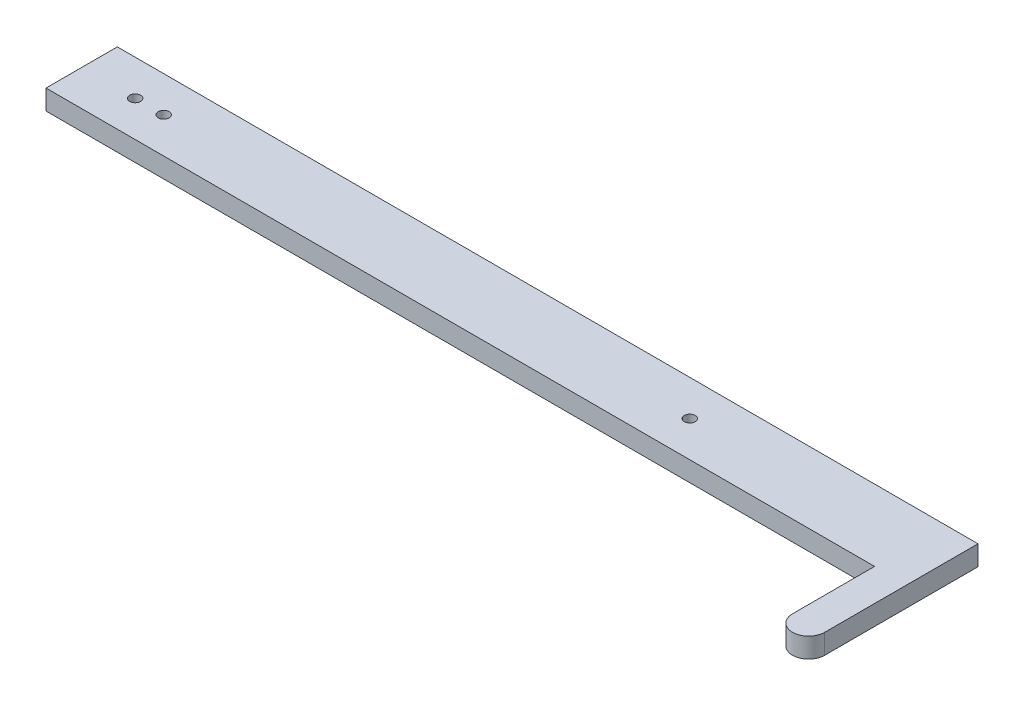
ISO-10303-21;
HEADER;
FILE_DESCRIPTION(('STEP AP214'),'2;1');
FILE_NAME('part.step','',(''),(''),'','','');
FILE_SCHEMA(('AUTOMOTIVE_DESIGN { 1 0 10303 214 1 1 1 1 }'));
ENDSEC;
DATA;
#1=APPLICATION_CONTEXT('core data for automotive mechanical design processes');
#2=APPLICATION_PROTOCOL_DEFINITION('international standard','automotive_design',2000,#1);
#3=PRODUCT_CONTEXT('',#1,'mechanical');
#4=PRODUCT('Part','Part','',(#3));
#5=PRODUCT_RELATED_PRODUCT_CATEGORY('part','',(#4));
#6=PRODUCT_DEFINITION_FORMATION('','',#4);
#7=PRODUCT_DEFINITION_CONTEXT('part definition',#1,'design');
#8=PRODUCT_DEFINITION('design','',#6,#7);
#9=PRODUCT_DEFINITION_SHAPE('','',#8);
#10=(LENGTH_UNIT() NAMED_UNIT(*) SI_UNIT(.MILLI.,.METRE.));
#11=(NAMED_UNIT(*) PLANE_ANGLE_UNIT() SI_UNIT($,.RADIAN.));
#12=(NAMED_UNIT(*) SI_UNIT($,.STERADIAN.) SOLID_ANGLE_UNIT());
#13=UNCERTAINTY_MEASURE_WITH_UNIT(LENGTH_MEASURE(1.E-05),#10,'distance_accuracy_value','');
#14=(GEOMETRIC_REPRESENTATION_CONTEXT(3) GLOBAL_UNCERTAINTY_ASSIGNED_CONTEXT((#13)) GLOBAL_UNIT_ASSIGNED_CONTEXT((#10,
#11,#12)) REPRESENTATION_CONTEXT('',''));
#15=CARTESIAN_POINT('',(0.,0.,0.));
#16=DIRECTION('',(0.,0.,1.));
#17=DIRECTION('',(1.,0.,0.));
#18=AXIS2_PLACEMENT_3D('',#15,#16,#17);
#19=CARTESIAN_POINT('',(-167.258825084748,5.588,-11.5655431332389));
#20=DIRECTION('',(1.,0.,0.));
#21=DIRECTION('',(0.,0.,-1.));
#22=AXIS2_PLACEMENT_3D('',#19,#20,#21);
#23=PLANE('',#22);
#24=DIRECTION('',(0.,0.,1.));
#25=VECTOR('',#24,1.);
#26=CARTESIAN_POINT('',(-167.258825084748,0.,-11.5655431332389));
#27=LINE('',#26,#25);
#28=CARTESIAN_POINT('',(-167.258825084748,0.,-11.5655431332389));
#29=VERTEX_POINT('',#28);
#30=CARTESIAN_POINT('',(-167.258825084748,0.,8.43445686676112));
#31=VERTEX_POINT('',#30);
#32=EDGE_CURVE('E122',#29,#31,#27,.T.);
#33=ORIENTED_EDGE('',*,*,#32,.T.);
#34=DIRECTION('',(0.,-1.,0.));
#35=VECTOR('',#34,1.);
#36=CARTESIAN_POINT('',(-167.258825084748,5.588,8.43445686676112));
#37=LINE('',#36,#35);
#38=CARTESIAN_POINT('',(-167.258825084748,5.588,8.43445686676112));
#39=VERTEX_POINT('',#38);
#40=EDGE_CURVE('E11',#39,#31,#37,.T.);
#41=ORIENTED_EDGE('',*,*,#40,.F.);
#42=DIRECTION('',(0.,0.,1.));
#43=VECTOR('',#42,1.);
#44=CARTESIAN_POINT('',(-167.258825084748,5.588,-11.5655431332389));
#45=LINE('',#44,#43);
#46=CARTESIAN_POINT('',(-167.258825084748,5.588,-11.5655431332389));
#47=VERTEX_POINT('',#46);
#48=EDGE_CURVE('E116',#47,#39,#45,.T.);
#49=ORIENTED_EDGE('',*,*,#48,.F.);
#50=DIRECTION('',(0.,-1.,0.));
#51=VECTOR('',#50,1.);
#52=CARTESIAN_POINT('',(-167.258825084748,5.588,-11.5655431332389));
#53=LINE('',#52,#51);
#54=EDGE_CURVE('E114',#47,#29,#53,.T.);
#55=ORIENTED_EDGE('',*,*,#54,.T.);
#56=EDGE_LOOP('',(#33,#41,#49,#55));
#57=FACE_BOUND('',#56,.T.);
#58=ADVANCED_FACE('F32',(#57),#23,.F.);
#59=CARTESIAN_POINT('',(-167.258825084748,5.588,8.43445686676112));
#60=DIRECTION('',(0.,0.,-1.));
#61=DIRECTION('',(-1.,0.,0.));
#62=AXIS2_PLACEMENT_3D('',#59,#60,#61);
#63=PLANE('',#62);
#64=DIRECTION('',(1.,0.,0.));
#65=VECTOR('',#64,1.);
#66=CARTESIAN_POINT('',(-167.258825084748,0.,8.43445686676112));
#67=LINE('',#66,#65);
#68=CARTESIAN_POINT('',(65.0411749152516,0.,8.43445686676112));
#69=VERTEX_POINT('',#68);
#70=EDGE_CURVE('E125',#31,#69,#67,.T.);
#71=ORIENTED_EDGE('',*,*,#70,.T.);
#72=DIRECTION('',(0.,1.,0.));
#73=VECTOR('',#72,1.);
#74=CARTESIAN_POINT('',(65.0411749152516,-24.6981780704569,8.43445686676112));
#75=LINE('',#74,#73);
#76=CARTESIAN_POINT('',(65.0411749152515,5.588,8.43445686676112));
#77=VERTEX_POINT('',#76);
#78=EDGE_CURVE('E105',#69,#77,#75,.T.);
#79=ORIENTED_EDGE('',*,*,#78,.T.);
#80=DIRECTION('',(1.,0.,0.));
#81=VECTOR('',#80,1.);
#82=CARTESIAN_POINT('',(-167.258825084748,5.588,8.43445686676112));
#83=LINE('',#82,#81);
#84=EDGE_CURVE('E79',#39,#77,#83,.T.);
#85=ORIENTED_EDGE('',*,*,#84,.F.);
#86=ORIENTED_EDGE('',*,*,#40,.T.);
#87=EDGE_LOOP('',(#71,#79,#85,#86));
#88=FACE_BOUND('',#87,.T.);
#89=ADVANCED_FACE('F168',(#88),#63,.F.);
#90=CARTESIAN_POINT('',(74.0411749152516,5.588,-11.5655431332389));
#91=DIRECTION('',(-1.,0.,0.));
#92=DIRECTION('',(0.,0.,1.));
#93=AXIS2_PLACEMENT_3D('',#90,#91,#92);
#94=PLANE('',#93);
#95=DIRECTION('',(0.,0.,-1.));
#96=VECTOR('',#95,1.);
#97=CARTESIAN_POINT('',(74.0411749152516,0.,-11.5655431332389));
#98=LINE('',#97,#96);
#99=CARTESIAN_POINT('',(74.0411749152516,0.,31.4344568667611));
#100=VERTEX_POINT('',#99);
#101=CARTESIAN_POINT('',(74.0411749152516,0.,-11.5655431332389));
#102=VERTEX_POINT('',#101);
#103=EDGE_CURVE('E129',#100,#102,#98,.T.);
#104=ORIENTED_EDGE('',*,*,#103,.T.);
#105=DIRECTION('',(0.,-1.,0.));
#106=VECTOR('',#105,1.);
#107=CARTESIAN_POINT('',(74.0411749152516,5.588,-11.5655431332389));
#108=LINE('',#107,#106);
#109=CARTESIAN_POINT('',(74.0411749152516,5.588,-11.5655431332389));
#110=VERTEX_POINT('',#109);
#111=EDGE_CURVE('E40',#110,#102,#108,.T.);
#112=ORIENTED_EDGE('',*,*,#111,.F.);
#113=DIRECTION('',(0.,0.,-1.));
#114=VECTOR('',#113,1.);
#115=CARTESIAN_POINT('',(74.0411749152516,5.588,-11.5655431332389));
#116=LINE('',#115,#114);
#117=CARTESIAN_POINT('',(74.0411749152516,5.588,31.4344568667611));
#118=VERTEX_POINT('',#117);
#119=EDGE_CURVE('E109',#118,#110,#116,.T.);
#120=ORIENTED_EDGE('',*,*,#119,.F.);
#121=DIRECTION('',(0.,1.,0.));
#122=VECTOR('',#121,1.);
#123=CARTESIAN_POINT('',(74.0411749152516,-24.6981780704569,31.4344568667611));
#124=LINE('',#123,#122);
#125=EDGE_CURVE('E96',#100,#118,#124,.T.);
#126=ORIENTED_EDGE('',*,*,#125,.F.);
#127=EDGE_LOOP('',(#104,#112,#120,#126));
#128=FACE_BOUND('',#127,.T.);
#129=ADVANCED_FACE('F112',(#128),#94,.F.);
#130=CARTESIAN_POINT('',(-167.258825084748,5.588,-11.5655431332389));
#131=DIRECTION('',(0.,0.,1.));
#132=DIRECTION('',(1.,0.,0.));
#133=AXIS2_PLACEMENT_3D('',#130,#131,#132);
#134=PLANE('',#133);
#135=DIRECTION('',(-1.,0.,0.));
#136=VECTOR('',#135,1.);
#137=CARTESIAN_POINT('',(-167.258825084748,0.,-11.5655431332389));
#138=LINE('',#137,#136);
#139=EDGE_CURVE('E74',#102,#29,#138,.T.);
#140=ORIENTED_EDGE('',*,*,#139,.T.);
#141=ORIENTED_EDGE('',*,*,#54,.F.);
#142=DIRECTION('',(-1.,0.,0.));
#143=VECTOR('',#142,1.);
#144=CARTESIAN_POINT('',(-167.258825084748,5.588,-11.5655431332389));
#145=LINE('',#144,#143);
#146=EDGE_CURVE('E57',#110,#47,#145,.T.);
#147=ORIENTED_EDGE('',*,*,#146,.F.);
#148=ORIENTED_EDGE('',*,*,#111,.T.);
#149=EDGE_LOOP('',(#140,#141,#147,#148));
#150=FACE_BOUND('',#149,.T.);
#151=ADVANCED_FACE('F163',(#150),#134,.F.);
#152=CARTESIAN_POINT('',(0.,5.588,0.));
#153=DIRECTION('',(0.,1.,0.));
#154=DIRECTION('',(0.,0.,1.));
#155=AXIS2_PLACEMENT_3D('',#152,#153,#154);
#156=PLANE('',#155);
#157=CARTESIAN_POINT('',(-144.258825084748,5.588,-1.56554313323885));
#158=DIRECTION('',(0.,1.,0.));
#159=DIRECTION('',(0.,0.,1.));
#160=AXIS2_PLACEMENT_3D('',#157,#158,#159);
#161=CIRCLE('',#160,1.52500000000001);
#162=CARTESIAN_POINT('',(-144.258825084748,5.588,-0.0405431332388456));
#163=VERTEX_POINT('',#162);
#164=EDGE_CURVE('E144',#163,#163,#161,.T.);
#165=ORIENTED_EDGE('',*,*,#164,.F.);
#166=EDGE_LOOP('',(#165));
#167=FACE_BOUND('',#166,.T.);
#168=CARTESIAN_POINT('',(-152.258825084748,5.588,-1.56554313323885));
#169=DIRECTION('',(0.,1.,0.));
#170=DIRECTION('',(0.,0.,1.));
#171=AXIS2_PLACEMENT_3D('',#168,#169,#170);
#172=CIRCLE('',#171,1.52500000000001);
#173=CARTESIAN_POINT('',(-152.258825084748,5.588,-0.0405431332388456));
#174=VERTEX_POINT('',#173);
#175=EDGE_CURVE('E150',#174,#174,#172,.T.);
#176=ORIENTED_EDGE('',*,*,#175,.F.);
#177=EDGE_LOOP('',(#176));
#178=FACE_BOUND('',#177,.T.);
#179=CARTESIAN_POINT('',(3.24117491525155,5.588,-1.56554313323886));
#180=DIRECTION('',(0.,1.,0.));
#181=DIRECTION('',(0.,0.,1.));
#182=AXIS2_PLACEMENT_3D('',#179,#180,#181);
#183=CIRCLE('',#182,1.525);
#184=CARTESIAN_POINT('',(3.24117491525155,5.588,-0.0405431332388682));
#185=VERTEX_POINT('',#184);
#186=EDGE_CURVE('E156',#185,#185,#183,.T.);
#187=ORIENTED_EDGE('',*,*,#186,.F.);
#188=EDGE_LOOP('',(#187));
#189=FACE_BOUND('',#188,.T.);
#190=ORIENTED_EDGE('',*,*,#48,.T.);
#191=ORIENTED_EDGE('',*,*,#84,.T.);
#192=DIRECTION('',(0.,0.,1.));
#193=VECTOR('',#192,1.);
#194=CARTESIAN_POINT('',(65.0411749152516,5.588,8.43445686676112));
#195=LINE('',#194,#193);
#196=CARTESIAN_POINT('',(65.0411749152516,5.588,31.4344568667611));
#197=VERTEX_POINT('',#196);
#198=EDGE_CURVE('E48',#77,#197,#195,.T.);
#199=ORIENTED_EDGE('',*,*,#198,.T.);
#200=CARTESIAN_POINT('',(69.5411749152515,5.588,31.4344568667611));
#201=DIRECTION('',(0.,1.,0.));
#202=DIRECTION('',(0.,0.,1.));
#203=AXIS2_PLACEMENT_3D('',#200,#201,#202);
#204=CIRCLE('',#203,4.5);
#205=EDGE_CURVE('E99',#197,#118,#204,.T.);
#206=ORIENTED_EDGE('',*,*,#205,.T.);
#207=ORIENTED_EDGE('',*,*,#119,.T.);
#208=ORIENTED_EDGE('',*,*,#146,.T.);
#209=EDGE_LOOP('',(#190,#191,#199,#206,#207,#208));
#210=FACE_BOUND('',#209,.T.);
#211=ADVANCED_FACE('F108',(#167,#178,#189,#210),#156,.T.);
#212=CARTESIAN_POINT('',(0.,0.,0.));
#213=DIRECTION('',(0.,1.,0.));
#214=DIRECTION('',(0.,0.,1.));
#215=AXIS2_PLACEMENT_3D('',#212,#213,#214);
#216=PLANE('',#215);
#217=CARTESIAN_POINT('',(-144.258825084748,0.,-1.56554313323885));
#218=DIRECTION('',(0.,1.,0.));
#219=DIRECTION('',(0.,0.,1.));
#220=AXIS2_PLACEMENT_3D('',#217,#218,#219);
#221=CIRCLE('',#220,1.52500000000001);
#222=CARTESIAN_POINT('',(-144.258825084748,0.,-0.0405431332388456));
#223=VERTEX_POINT('',#222);
#224=EDGE_CURVE('E147',#223,#223,#221,.F.);
#225=ORIENTED_EDGE('',*,*,#224,.F.);
#226=EDGE_LOOP('',(#225));
#227=FACE_BOUND('',#226,.T.);
#228=CARTESIAN_POINT('',(-152.258825084748,0.,-1.56554313323885));
#229=DIRECTION('',(0.,1.,0.));
#230=DIRECTION('',(0.,0.,1.));
#231=AXIS2_PLACEMENT_3D('',#228,#229,#230);
#232=CIRCLE('',#231,1.52500000000001);
#233=CARTESIAN_POINT('',(-152.258825084748,0.,-0.0405431332388456));
#234=VERTEX_POINT('',#233);
#235=EDGE_CURVE('E153',#234,#234,#232,.F.);
#236=ORIENTED_EDGE('',*,*,#235,.F.);
#237=EDGE_LOOP('',(#236));
#238=FACE_BOUND('',#237,.T.);
#239=CARTESIAN_POINT('',(3.24117491525155,0.,-1.56554313323886));
#240=DIRECTION('',(0.,1.,0.));
#241=DIRECTION('',(0.,0.,1.));
#242=AXIS2_PLACEMENT_3D('',#239,#240,#241);
#243=CIRCLE('',#242,1.525);
#244=CARTESIAN_POINT('',(3.24117491525155,0.,-0.0405431332388682));
#245=VERTEX_POINT('',#244);
#246=EDGE_CURVE('E126',#245,#245,#243,.F.);
#247=ORIENTED_EDGE('',*,*,#246,.F.);
#248=EDGE_LOOP('',(#247));
#249=FACE_BOUND('',#248,.T.);
#250=ORIENTED_EDGE('',*,*,#32,.F.);
#251=ORIENTED_EDGE('',*,*,#139,.F.);
#252=ORIENTED_EDGE('',*,*,#103,.F.);
#253=CARTESIAN_POINT('',(69.5411749152515,0.,31.4344568667611));
#254=DIRECTION('',(0.,1.,0.));
#255=DIRECTION('',(0.,0.,1.));
#256=AXIS2_PLACEMENT_3D('',#253,#254,#255);
#257=CIRCLE('',#256,4.5);
#258=CARTESIAN_POINT('',(65.0411749152516,0.,31.4344568667611));
#259=VERTEX_POINT('',#258);
#260=EDGE_CURVE('E101',#100,#259,#257,.F.);
#261=ORIENTED_EDGE('',*,*,#260,.T.);
#262=DIRECTION('',(0.,0.,-1.));
#263=VECTOR('',#262,1.);
#264=CARTESIAN_POINT('',(65.0411749152516,0.,8.43445686676112));
#265=LINE('',#264,#263);
#266=EDGE_CURVE('E139',#259,#69,#265,.T.);
#267=ORIENTED_EDGE('',*,*,#266,.T.);
#268=ORIENTED_EDGE('',*,*,#70,.F.);
#269=EDGE_LOOP('',(#250,#251,#252,#261,#267,#268));
#270=FACE_BOUND('',#269,.T.);
#271=ADVANCED_FACE('F166',(#227,#238,#249,#270),#216,.F.);
#272=CARTESIAN_POINT('',(3.24117491525155,-0.00100000000000013,-1.56554313323886));
#273=DIRECTION('',(0.,1.,0.));
#274=DIRECTION('',(0.,0.,1.));
#275=AXIS2_PLACEMENT_3D('',#272,#273,#274);
#276=CYLINDRICAL_SURFACE('',#275,1.525);
#277=CARTESIAN_POINT('',(3.24117491525155,5.588,-0.0405431332388682));
#278=CARTESIAN_POINT('',(3.24117491525155,5.52979166666667,-0.0405431332388682));
#279=CARTESIAN_POINT('',(3.24117491525155,5.47158333333333,-0.0405431332388682));
#280=CARTESIAN_POINT('',(3.24117491525155,5.35516666666667,-0.0405431332388682));
#281=CARTESIAN_POINT('',(3.24117491525155,5.29695833333333,-0.0405431332388682));
#282=CARTESIAN_POINT('',(3.24117491525155,5.18054166666667,-0.0405431332388682));
#283=CARTESIAN_POINT('',(3.24117491525155,5.12233333333333,-0.0405431332388682));
#284=CARTESIAN_POINT('',(3.24117491525155,5.00591666666667,-0.0405431332388682));
#285=CARTESIAN_POINT('',(3.24117491525155,4.94770833333333,-0.0405431332388682));
#286=CARTESIAN_POINT('',(3.24117491525155,4.83129166666667,-0.0405431332388682));
#287=CARTESIAN_POINT('',(3.24117491525155,4.77308333333333,-0.0405431332388682));
#288=CARTESIAN_POINT('',(3.24117491525155,4.65666666666667,-0.0405431332388682));
#289=CARTESIAN_POINT('',(3.24117491525155,4.59845833333333,-0.0405431332388682));
#290=CARTESIAN_POINT('',(3.24117491525155,4.48204166666667,-0.0405431332388682));
#291=CARTESIAN_POINT('',(3.24117491525155,4.42383333333333,-0.0405431332388682));
#292=CARTESIAN_POINT('',(3.24117491525155,4.30741666666667,-0.0405431332388682));
#293=CARTESIAN_POINT('',(3.24117491525155,4.24920833333333,-0.0405431332388682));
#294=CARTESIAN_POINT('',(3.24117491525155,4.13279166666667,-0.0405431332388682));
#295=CARTESIAN_POINT('',(3.24117491525155,4.07458333333333,-0.0405431332388682));
#296=CARTESIAN_POINT('',(3.24117491525155,3.95816666666667,-0.0405431332388682));
#297=CARTESIAN_POINT('',(3.24117491525155,3.89995833333333,-0.0405431332388682));
#298=CARTESIAN_POINT('',(3.24117491525155,3.78354166666667,-0.0405431332388682));
#299=CARTESIAN_POINT('',(3.24117491525155,3.72533333333333,-0.0405431332388682));
#300=CARTESIAN_POINT('',(3.24117491525155,3.60891666666667,-0.0405431332388682));
#301=CARTESIAN_POINT('',(3.24117491525155,3.55070833333333,-0.0405431332388682));
#302=CARTESIAN_POINT('',(3.24117491525155,3.43429166666667,-0.0405431332388682));
#303=CARTESIAN_POINT('',(3.24117491525155,3.37608333333333,-0.0405431332388682));
#304=CARTESIAN_POINT('',(3.24117491525155,3.25966666666667,-0.0405431332388682));
#305=CARTESIAN_POINT('',(3.24117491525155,3.20145833333333,-0.0405431332388682));
#306=CARTESIAN_POINT('',(3.24117491525155,3.08504166666667,-0.0405431332388682));
#307=CARTESIAN_POINT('',(3.24117491525155,3.02683333333333,-0.0405431332388682));
#308=CARTESIAN_POINT('',(3.24117491525155,2.91041666666667,-0.0405431332388682));
#309=CARTESIAN_POINT('',(3.24117491525155,2.85220833333333,-0.0405431332388682));
#310=CARTESIAN_POINT('',(3.24117491525155,2.73579166666667,-0.0405431332388682));
#311=CARTESIAN_POINT('',(3.24117491525155,2.67758333333333,-0.0405431332388682));
#312=CARTESIAN_POINT('',(3.24117491525155,2.56116666666667,-0.0405431332388682));
#313=CARTESIAN_POINT('',(3.24117491525155,2.50295833333333,-0.0405431332388682));
#314=CARTESIAN_POINT('',(3.24117491525155,2.38654166666667,-0.0405431332388682));
#315=CARTESIAN_POINT('',(3.24117491525155,2.32833333333333,-0.0405431332388682));
#316=CARTESIAN_POINT('',(3.24117491525155,2.21191666666667,-0.0405431332388682));
#317=CARTESIAN_POINT('',(3.24117491525155,2.15370833333333,-0.0405431332388682));
#318=CARTESIAN_POINT('',(3.24117491525155,2.03729166666667,-0.0405431332388682));
#319=CARTESIAN_POINT('',(3.24117491525155,1.97908333333333,-0.0405431332388682));
#320=CARTESIAN_POINT('',(3.24117491525155,1.86266666666667,-0.0405431332388682));
#321=CARTESIAN_POINT('',(3.24117491525155,1.80445833333333,-0.0405431332388682));
#322=CARTESIAN_POINT('',(3.24117491525155,1.68804166666667,-0.0405431332388682));
#323=CARTESIAN_POINT('',(3.24117491525155,1.62983333333333,-0.0405431332388682));
#324=CARTESIAN_POINT('',(3.24117491525155,1.51341666666667,-0.0405431332388682));
#325=CARTESIAN_POINT('',(3.24117491525155,1.45520833333333,-0.0405431332388682));
#326=CARTESIAN_POINT('',(3.24117491525155,1.33879166666667,-0.0405431332388682));
#327=CARTESIAN_POINT('',(3.24117491525155,1.28058333333333,-0.0405431332388682));
#328=CARTESIAN_POINT('',(3.24117491525155,1.16416666666667,-0.0405431332388682));
#329=CARTESIAN_POINT('',(3.24117491525155,1.10595833333333,-0.0405431332388682));
#330=CARTESIAN_POINT('',(3.24117491525155,0.989541666666667,-0.0405431332388682));
#331=CARTESIAN_POINT('',(3.24117491525155,0.931333333333333,-0.0405431332388682));
#332=CARTESIAN_POINT('',(3.24117491525155,0.814916666666667,-0.0405431332388682));
#333=CARTESIAN_POINT('',(3.24117491525155,0.756708333333333,-0.0405431332388682));
#334=CARTESIAN_POINT('',(3.24117491525155,0.640291666666667,-0.0405431332388682));
#335=CARTESIAN_POINT('',(3.24117491525155,0.582083333333333,-0.0405431332388682));
#336=CARTESIAN_POINT('',(3.24117491525155,0.465666666666667,-0.0405431332388682));
#337=CARTESIAN_POINT('',(3.24117491525155,0.407458333333333,-0.0405431332388682));
#338=CARTESIAN_POINT('',(3.24117491525155,0.291041666666667,-0.0405431332388682));
#339=CARTESIAN_POINT('',(3.24117491525155,0.232833333333333,-0.0405431332388682));
#340=CARTESIAN_POINT('',(3.24117491525155,0.116416666666667,-0.0405431332388682));
#341=CARTESIAN_POINT('',(3.24117491525155,0.0582083333333334,-0.0405431332388682));
#342=CARTESIAN_POINT('',(3.24117491525155,0.,-0.0405431332388682));
#343=B_SPLINE_CURVE_WITH_KNOTS('',3,(#277,#278,#279,#280,#281,#282,#283,#284,#285,#286,#287,
#288,#289,#290,#291,#292,#293,#294,#295,#296,#297,#298,#299,#300,#301,#302,#303,#304,#305,#306,
#307,#308,#309,#310,#311,#312,#313,#314,#315,#316,#317,#318,#319,#320,#321,#322,#323,#324,#325,
#326,#327,#328,#329,#330,#331,#332,#333,#334,#335,#336,#337,#338,#339,#340,#341,#342),
.UNSPECIFIED.,.F.,.F.,(4,2,2,2,2,2,2,2,2,2,2,2,2,2,2,2,2,2,2,2,2,2,2,2,2,2,2,2,2,2,2,2,4),(0.,
0.174625,0.34925,0.523875,0.6985,0.873125,1.04775,1.222375,1.397,1.571625,1.74625,1.920875,
2.0955,2.270125,2.44475,2.619375,2.794,2.968625,3.14325,3.317875,3.4925,3.667125,3.84175,
4.016375,4.191,4.365625,4.54025,4.714875,4.8895,5.064125,5.23875,5.413375,5.588),.UNSPECIFIED.);
#344=EDGE_CURVE('BSEAM195',#185,#245,#343,.T.);
#345=ORIENTED_EDGE('',*,*,#186,.T.);
#346=ORIENTED_EDGE('',*,*,#246,.T.);
#347=ORIENTED_EDGE('',*,*,#344,.T.);
#348=ORIENTED_EDGE('',*,*,#344,.F.);
#349=EDGE_LOOP('',(#345,#347,#346,#348));
#350=FACE_BOUND('',#349,.T.);
#351=ADVANCED_FACE('F195',(#350),#276,.F.);
#352=CARTESIAN_POINT('',(-152.258825084748,-0.00100000000000013,-1.56554313323885));
#353=DIRECTION('',(0.,1.,0.));
#354=DIRECTION('',(0.,0.,1.));
#355=AXIS2_PLACEMENT_3D('',#352,#353,#354);
#356=CYLINDRICAL_SURFACE('',#355,1.52500000000001);
#357=CARTESIAN_POINT('',(-152.258825084748,5.588,-0.0405431332388456));
#358=CARTESIAN_POINT('',(-152.258825084748,5.52979166666667,-0.0405431332388456));
#359=CARTESIAN_POINT('',(-152.258825084748,5.47158333333333,-0.0405431332388456));
#360=CARTESIAN_POINT('',(-152.258825084748,5.35516666666667,-0.0405431332388456));
#361=CARTESIAN_POINT('',(-152.258825084748,5.29695833333333,-0.0405431332388456));
#362=CARTESIAN_POINT('',(-152.258825084748,5.18054166666667,-0.0405431332388456));
#363=CARTESIAN_POINT('',(-152.258825084748,5.12233333333333,-0.0405431332388456));
#364=CARTESIAN_POINT('',(-152.258825084748,5.00591666666667,-0.0405431332388456));
#365=CARTESIAN_POINT('',(-152.258825084748,4.94770833333333,-0.0405431332388456));
#366=CARTESIAN_POINT('',(-152.258825084748,4.83129166666667,-0.0405431332388456));
#367=CARTESIAN_POINT('',(-152.258825084748,4.77308333333333,-0.0405431332388456));
#368=CARTESIAN_POINT('',(-152.258825084748,4.65666666666667,-0.0405431332388456));
#369=CARTESIAN_POINT('',(-152.258825084748,4.59845833333333,-0.0405431332388456));
#370=CARTESIAN_POINT('',(-152.258825084748,4.48204166666667,-0.0405431332388456));
#371=CARTESIAN_POINT('',(-152.258825084748,4.42383333333333,-0.0405431332388456));
#372=CARTESIAN_POINT('',(-152.258825084748,4.30741666666667,-0.0405431332388456));
#373=CARTESIAN_POINT('',(-152.258825084748,4.24920833333333,-0.0405431332388456));
#374=CARTESIAN_POINT('',(-152.258825084748,4.13279166666667,-0.0405431332388456));
#375=CARTESIAN_POINT('',(-152.258825084748,4.07458333333333,-0.0405431332388456));
#376=CARTESIAN_POINT('',(-152.258825084748,3.95816666666667,-0.0405431332388456));
#377=CARTESIAN_POINT('',(-152.258825084748,3.89995833333333,-0.0405431332388456));
#378=CARTESIAN_POINT('',(-152.258825084748,3.78354166666667,-0.0405431332388456));
#379=CARTESIAN_POINT('',(-152.258825084748,3.72533333333333,-0.0405431332388456));
#380=CARTESIAN_POINT('',(-152.258825084748,3.60891666666667,-0.0405431332388456));
#381=CARTESIAN_POINT('',(-152.258825084748,3.55070833333333,-0.0405431332388456));
#382=CARTESIAN_POINT('',(-152.258825084748,3.43429166666667,-0.0405431332388456));
#383=CARTESIAN_POINT('',(-152.258825084748,3.37608333333333,-0.0405431332388456));
#384=CARTESIAN_POINT('',(-152.258825084748,3.25966666666667,-0.0405431332388456));
#385=CARTESIAN_POINT('',(-152.258825084748,3.20145833333333,-0.0405431332388456));
#386=CARTESIAN_POINT('',(-152.258825084748,3.08504166666667,-0.0405431332388456));
#387=CARTESIAN_POINT('',(-152.258825084748,3.02683333333333,-0.0405431332388456));
#388=CARTESIAN_POINT('',(-152.258825084748,2.91041666666667,-0.0405431332388456));
#389=CARTESIAN_POINT('',(-152.258825084748,2.85220833333333,-0.0405431332388456));
#390=CARTESIAN_POINT('',(-152.258825084748,2.73579166666667,-0.0405431332388456));
#391=CARTESIAN_POINT('',(-152.258825084748,2.67758333333333,-0.0405431332388456));
#392=CARTESIAN_POINT('',(-152.258825084748,2.56116666666667,-0.0405431332388456));
#393=CARTESIAN_POINT('',(-152.258825084748,2.50295833333333,-0.0405431332388456));
#394=CARTESIAN_POINT('',(-152.258825084748,2.38654166666667,-0.0405431332388456));
#395=CARTESIAN_POINT('',(-152.258825084748,2.32833333333333,-0.0405431332388456));
#396=CARTESIAN_POINT('',(-152.258825084748,2.21191666666667,-0.0405431332388456));
#397=CARTESIAN_POINT('',(-152.258825084748,2.15370833333333,-0.0405431332388456));
#398=CARTESIAN_POINT('',(-152.258825084748,2.03729166666667,-0.0405431332388456));
#399=CARTESIAN_POINT('',(-152.258825084748,1.97908333333333,-0.0405431332388456));
#400=CARTESIAN_POINT('',(-152.258825084748,1.86266666666667,-0.0405431332388456));
#401=CARTESIAN_POINT('',(-152.258825084748,1.80445833333333,-0.0405431332388456));
#402=CARTESIAN_POINT('',(-152.258825084748,1.68804166666667,-0.0405431332388456));
#403=CARTESIAN_POINT('',(-152.258825084748,1.62983333333333,-0.0405431332388456));
#404=CARTESIAN_POINT('',(-152.258825084748,1.51341666666667,-0.0405431332388456));
#405=CARTESIAN_POINT('',(-152.258825084748,1.45520833333333,-0.0405431332388456));
#406=CARTESIAN_POINT('',(-152.258825084748,1.33879166666667,-0.0405431332388456));
#407=CARTESIAN_POINT('',(-152.258825084748,1.28058333333333,-0.0405431332388456));
#408=CARTESIAN_POINT('',(-152.258825084748,1.16416666666667,-0.0405431332388456));
#409=CARTESIAN_POINT('',(-152.258825084748,1.10595833333333,-0.0405431332388456));
#410=CARTESIAN_POINT('',(-152.258825084748,0.989541666666667,-0.0405431332388456));
#411=CARTESIAN_POINT('',(-152.258825084748,0.931333333333333,-0.0405431332388456));
#412=CARTESIAN_POINT('',(-152.258825084748,0.814916666666667,-0.0405431332388456));
#413=CARTESIAN_POINT('',(-152.258825084748,0.756708333333333,-0.0405431332388456));
#414=CARTESIAN_POINT('',(-152.258825084748,0.640291666666667,-0.0405431332388456));
#415=CARTESIAN_POINT('',(-152.258825084748,0.582083333333333,-0.0405431332388456));
#416=CARTESIAN_POINT('',(-152.258825084748,0.465666666666667,-0.0405431332388456));
#417=CARTESIAN_POINT('',(-152.258825084748,0.407458333333333,-0.0405431332388456));
#418=CARTESIAN_POINT('',(-152.258825084748,0.291041666666667,-0.0405431332388456));
#419=CARTESIAN_POINT('',(-152.258825084748,0.232833333333333,-0.0405431332388456));
#420=CARTESIAN_POINT('',(-152.258825084748,0.116416666666667,-0.0405431332388456));
#421=CARTESIAN_POINT('',(-152.258825084748,0.0582083333333334,-0.0405431332388456));
#422=CARTESIAN_POINT('',(-152.258825084748,0.,-0.0405431332388456));
#423=B_SPLINE_CURVE_WITH_KNOTS('',3,(#357,#358,#359,#360,#361,#362,#363,#364,#365,#366,#367,
#368,#369,#370,#371,#372,#373,#374,#375,#376,#377,#378,#379,#380,#381,#382,#383,#384,#385,#386,
#387,#388,#389,#390,#391,#392,#393,#394,#395,#396,#397,#398,#399,#400,#401,#402,#403,#404,#405,
#406,#407,#408,#409,#410,#411,#412,#413,#414,#415,#416,#417,#418,#419,#420,#421,#422),
.UNSPECIFIED.,.F.,.F.,(4,2,2,2,2,2,2,2,2,2,2,2,2,2,2,2,2,2,2,2,2,2,2,2,2,2,2,2,2,2,2,2,4),(0.,
0.174625,0.34925,0.523875,0.6985,0.873125,1.04775,1.222375,1.397,1.571625,1.74625,1.920875,
2.0955,2.270125,2.44475,2.619375,2.794,2.968625,3.14325,3.317875,3.4925,3.667125,3.84175,
4.016375,4.191,4.365625,4.54025,4.714875,4.8895,5.064125,5.23875,5.413375,5.588),.UNSPECIFIED.);
#424=EDGE_CURVE('BSEAM179',#174,#234,#423,.T.);
#425=ORIENTED_EDGE('',*,*,#175,.T.);
#426=ORIENTED_EDGE('',*,*,#235,.T.);
#427=ORIENTED_EDGE('',*,*,#424,.T.);
#428=ORIENTED_EDGE('',*,*,#424,.F.);
#429=EDGE_LOOP('',(#425,#427,#426,#428));
#430=FACE_BOUND('',#429,.T.);
#431=ADVANCED_FACE('F179',(#430),#356,.F.);
#432=CARTESIAN_POINT('',(-144.258825084748,-0.00100000000000013,-1.56554313323885));
#433=DIRECTION('',(0.,1.,0.));
#434=DIRECTION('',(0.,0.,1.));
#435=AXIS2_PLACEMENT_3D('',#432,#433,#434);
#436=CYLINDRICAL_SURFACE('',#435,1.52500000000001);
#437=CARTESIAN_POINT('',(-144.258825084748,5.588,-0.0405431332388456));
#438=CARTESIAN_POINT('',(-144.258825084748,5.52979166666667,-0.0405431332388456));
#439=CARTESIAN_POINT('',(-144.258825084748,5.47158333333333,-0.0405431332388456));
#440=CARTESIAN_POINT('',(-144.258825084748,5.35516666666667,-0.0405431332388456));
#441=CARTESIAN_POINT('',(-144.258825084748,5.29695833333333,-0.0405431332388456));
#442=CARTESIAN_POINT('',(-144.258825084748,5.18054166666667,-0.0405431332388456));
#443=CARTESIAN_POINT('',(-144.258825084748,5.12233333333333,-0.0405431332388456));
#444=CARTESIAN_POINT('',(-144.258825084748,5.00591666666667,-0.0405431332388456));
#445=CARTESIAN_POINT('',(-144.258825084748,4.94770833333333,-0.0405431332388456));
#446=CARTESIAN_POINT('',(-144.258825084748,4.83129166666667,-0.0405431332388456));
#447=CARTESIAN_POINT('',(-144.258825084748,4.77308333333333,-0.0405431332388456));
#448=CARTESIAN_POINT('',(-144.258825084748,4.65666666666667,-0.0405431332388456));
#449=CARTESIAN_POINT('',(-144.258825084748,4.59845833333333,-0.0405431332388456));
#450=CARTESIAN_POINT('',(-144.258825084748,4.48204166666667,-0.0405431332388456));
#451=CARTESIAN_POINT('',(-144.258825084748,4.42383333333333,-0.0405431332388456));
#452=CARTESIAN_POINT('',(-144.258825084748,4.30741666666667,-0.0405431332388456));
#453=CARTESIAN_POINT('',(-144.258825084748,4.24920833333333,-0.0405431332388456));
#454=CARTESIAN_POINT('',(-144.258825084748,4.13279166666667,-0.0405431332388456));
#455=CARTESIAN_POINT('',(-144.258825084748,4.07458333333333,-0.0405431332388456));
#456=CARTESIAN_POINT('',(-144.258825084748,3.95816666666667,-0.0405431332388456));
#457=CARTESIAN_POINT('',(-144.258825084748,3.89995833333333,-0.0405431332388456));
#458=CARTESIAN_POINT('',(-144.258825084748,3.78354166666667,-0.0405431332388456));
#459=CARTESIAN_POINT('',(-144.258825084748,3.72533333333333,-0.0405431332388456));
#460=CARTESIAN_POINT('',(-144.258825084748,3.60891666666667,-0.0405431332388456));
#461=CARTESIAN_POINT('',(-144.258825084748,3.55070833333333,-0.0405431332388456));
#462=CARTESIAN_POINT('',(-144.258825084748,3.43429166666667,-0.0405431332388456));
#463=CARTESIAN_POINT('',(-144.258825084748,3.37608333333333,-0.0405431332388456));
#464=CARTESIAN_POINT('',(-144.258825084748,3.25966666666667,-0.0405431332388456));
#465=CARTESIAN_POINT('',(-144.258825084748,3.20145833333333,-0.0405431332388456));
#466=CARTESIAN_POINT('',(-144.258825084748,3.08504166666667,-0.0405431332388456));
#467=CARTESIAN_POINT('',(-144.258825084748,3.02683333333333,-0.0405431332388456));
#468=CARTESIAN_POINT('',(-144.258825084748,2.91041666666667,-0.0405431332388456));
#469=CARTESIAN_POINT('',(-144.258825084748,2.85220833333333,-0.0405431332388456));
#470=CARTESIAN_POINT('',(-144.258825084748,2.73579166666667,-0.0405431332388456));
#471=CARTESIAN_POINT('',(-144.258825084748,2.67758333333333,-0.0405431332388456));
#472=CARTESIAN_POINT('',(-144.258825084748,2.56116666666667,-0.0405431332388456));
#473=CARTESIAN_POINT('',(-144.258825084748,2.50295833333333,-0.0405431332388456));
#474=CARTESIAN_POINT('',(-144.258825084748,2.38654166666667,-0.0405431332388456));
#475=CARTESIAN_POINT('',(-144.258825084748,2.32833333333333,-0.0405431332388456));
#476=CARTESIAN_POINT('',(-144.258825084748,2.21191666666667,-0.0405431332388456));
#477=CARTESIAN_POINT('',(-144.258825084748,2.15370833333333,-0.0405431332388456));
#478=CARTESIAN_POINT('',(-144.258825084748,2.03729166666667,-0.0405431332388456));
#479=CARTESIAN_POINT('',(-144.258825084748,1.97908333333333,-0.0405431332388456));
#480=CARTESIAN_POINT('',(-144.258825084748,1.86266666666667,-0.0405431332388456));
#481=CARTESIAN_POINT('',(-144.258825084748,1.80445833333333,-0.0405431332388456));
#482=CARTESIAN_POINT('',(-144.258825084748,1.68804166666667,-0.0405431332388456));
#483=CARTESIAN_POINT('',(-144.258825084748,1.62983333333333,-0.0405431332388456));
#484=CARTESIAN_POINT('',(-144.258825084748,1.51341666666667,-0.0405431332388456));
#485=CARTESIAN_POINT('',(-144.258825084748,1.45520833333333,-0.0405431332388456));
#486=CARTESIAN_POINT('',(-144.258825084748,1.33879166666667,-0.0405431332388456));
#487=CARTESIAN_POINT('',(-144.258825084748,1.28058333333333,-0.0405431332388456));
#488=CARTESIAN_POINT('',(-144.258825084748,1.16416666666667,-0.0405431332388456));
#489=CARTESIAN_POINT('',(-144.258825084748,1.10595833333333,-0.0405431332388456));
#490=CARTESIAN_POINT('',(-144.258825084748,0.989541666666667,-0.0405431332388456));
#491=CARTESIAN_POINT('',(-144.258825084748,0.931333333333333,-0.0405431332388456));
#492=CARTESIAN_POINT('',(-144.258825084748,0.814916666666667,-0.0405431332388456));
#493=CARTESIAN_POINT('',(-144.258825084748,0.756708333333333,-0.0405431332388456));
#494=CARTESIAN_POINT('',(-144.258825084748,0.640291666666667,-0.0405431332388456));
#495=CARTESIAN_POINT('',(-144.258825084748,0.582083333333333,-0.0405431332388456));
#496=CARTESIAN_POINT('',(-144.258825084748,0.465666666666667,-0.0405431332388456));
#497=CARTESIAN_POINT('',(-144.258825084748,0.407458333333333,-0.0405431332388456));
#498=CARTESIAN_POINT('',(-144.258825084748,0.291041666666667,-0.0405431332388456));
#499=CARTESIAN_POINT('',(-144.258825084748,0.232833333333333,-0.0405431332388456));
#500=CARTESIAN_POINT('',(-144.258825084748,0.116416666666667,-0.0405431332388456));
#501=CARTESIAN_POINT('',(-144.258825084748,0.0582083333333334,-0.0405431332388456));
#502=CARTESIAN_POINT('',(-144.258825084748,0.,-0.0405431332388456));
#503=B_SPLINE_CURVE_WITH_KNOTS('',3,(#437,#438,#439,#440,#441,#442,#443,#444,#445,#446,#447,
#448,#449,#450,#451,#452,#453,#454,#455,#456,#457,#458,#459,#460,#461,#462,#463,#464,#465,#466,
#467,#468,#469,#470,#471,#472,#473,#474,#475,#476,#477,#478,#479,#480,#481,#482,#483,#484,#485,
#486,#487,#488,#489,#490,#491,#492,#493,#494,#495,#496,#497,#498,#499,#500,#501,#502),
.UNSPECIFIED.,.F.,.F.,(4,2,2,2,2,2,2,2,2,2,2,2,2,2,2,2,2,2,2,2,2,2,2,2,2,2,2,2,2,2,2,2,4),(0.,
0.174625,0.34925,0.523875,0.6985,0.873125,1.04775,1.222375,1.397,1.571625,1.74625,1.920875,
2.0955,2.270125,2.44475,2.619375,2.794,2.968625,3.14325,3.317875,3.4925,3.667125,3.84175,
4.016375,4.191,4.365625,4.54025,4.714875,4.8895,5.064125,5.23875,5.413375,5.588),.UNSPECIFIED.);
#504=EDGE_CURVE('BSEAM172',#163,#223,#503,.T.);
#505=ORIENTED_EDGE('',*,*,#164,.T.);
#506=ORIENTED_EDGE('',*,*,#224,.T.);
#507=ORIENTED_EDGE('',*,*,#504,.T.);
#508=ORIENTED_EDGE('',*,*,#504,.F.);
#509=EDGE_LOOP('',(#505,#507,#506,#508));
#510=FACE_BOUND('',#509,.T.);
#511=ADVANCED_FACE('F172',(#510),#436,.F.);
#512=CARTESIAN_POINT('',(65.0411749152516,-24.6981780704569,8.43445686676112));
#513=DIRECTION('',(-1.,0.,0.));
#514=DIRECTION('',(0.,0.,1.));
#515=AXIS2_PLACEMENT_3D('',#512,#513,#514);
#516=PLANE('',#515);
#517=ORIENTED_EDGE('',*,*,#266,.F.);
#518=DIRECTION('',(0.,1.,0.));
#519=VECTOR('',#518,1.);
#520=CARTESIAN_POINT('',(65.0411749152516,-24.6981780704569,31.4344568667611));
#521=LINE('',#520,#519);
#522=EDGE_CURVE('E106',#259,#197,#521,.T.);
#523=ORIENTED_EDGE('',*,*,#522,.T.);
#524=ORIENTED_EDGE('',*,*,#198,.F.);
#525=ORIENTED_EDGE('',*,*,#78,.F.);
#526=EDGE_LOOP('',(#517,#523,#524,#525));
#527=FACE_BOUND('',#526,.T.);
#528=ADVANCED_FACE('F170',(#527),#516,.T.);
#529=CARTESIAN_POINT('',(69.5411749152515,-10.0623058987491,31.4344568667611));
#530=DIRECTION('',(0.,1.,0.));
#531=DIRECTION('',(0.,0.,1.));
#532=AXIS2_PLACEMENT_3D('',#529,#530,#531);
#533=CYLINDRICAL_SURFACE('',#532,4.5);
#534=ORIENTED_EDGE('',*,*,#260,.F.);
#535=ORIENTED_EDGE('',*,*,#125,.T.);
#536=ORIENTED_EDGE('',*,*,#205,.F.);
#537=ORIENTED_EDGE('',*,*,#522,.F.);
#538=EDGE_LOOP('',(#534,#535,#536,#537));
#539=FACE_BOUND('',#538,.T.);
#540=ADVANCED_FACE('F98',(#539),#533,.T.);
#541=CLOSED_SHELL('',(#58,#89,#129,#151,#211,#271,#351,#431,#511,#528,#540));
#542=MANIFOLD_SOLID_BREP('B2',#541);
#543=ADVANCED_BREP_SHAPE_REPRESENTATION('',(#18,#542),#14);
#544=SHAPE_DEFINITION_REPRESENTATION(#9,#543);
ENDSEC;
END-ISO-10303-21;
